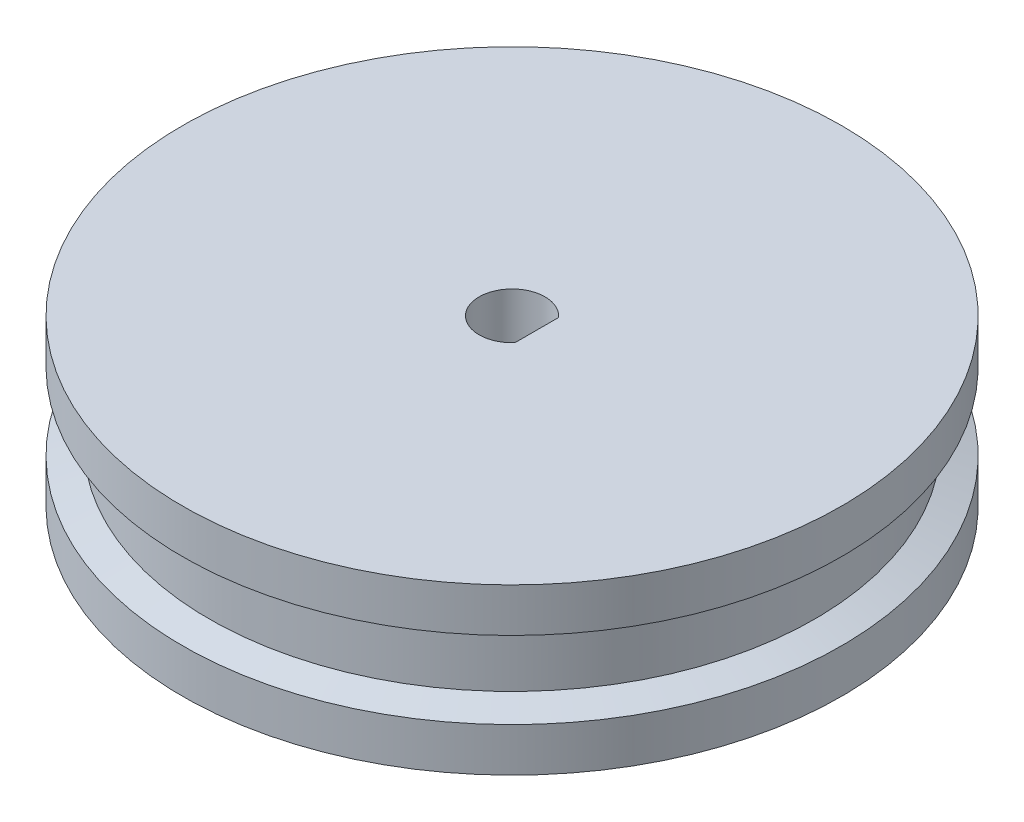
ISO-10303-21;
HEADER;
FILE_DESCRIPTION(('STEP AP214'),'2;1');
FILE_NAME('part.step','',(''),(''),'','','');
FILE_SCHEMA(('AUTOMOTIVE_DESIGN { 1 0 10303 214 1 1 1 1 }'));
ENDSEC;
DATA;
#1=APPLICATION_CONTEXT('core data for automotive mechanical design processes');
#2=APPLICATION_PROTOCOL_DEFINITION('international standard','automotive_design',2000,#1);
#3=PRODUCT_CONTEXT('',#1,'mechanical');
#4=PRODUCT('Part','Part','',(#3));
#5=PRODUCT_RELATED_PRODUCT_CATEGORY('part','',(#4));
#6=PRODUCT_DEFINITION_FORMATION('','',#4);
#7=PRODUCT_DEFINITION_CONTEXT('part definition',#1,'design');
#8=PRODUCT_DEFINITION('design','',#6,#7);
#9=PRODUCT_DEFINITION_SHAPE('','',#8);
#10=(LENGTH_UNIT() NAMED_UNIT(*) SI_UNIT(.MILLI.,.METRE.));
#11=(NAMED_UNIT(*) PLANE_ANGLE_UNIT() SI_UNIT($,.RADIAN.));
#12=(NAMED_UNIT(*) SI_UNIT($,.STERADIAN.) SOLID_ANGLE_UNIT());
#13=UNCERTAINTY_MEASURE_WITH_UNIT(LENGTH_MEASURE(1.E-05),#10,'distance_accuracy_value','');
#14=(GEOMETRIC_REPRESENTATION_CONTEXT(3) GLOBAL_UNCERTAINTY_ASSIGNED_CONTEXT((#13)) GLOBAL_UNIT_ASSIGNED_CONTEXT((#10,
#11,#12)) REPRESENTATION_CONTEXT('',''));
#15=CARTESIAN_POINT('',(0.,0.,0.));
#16=DIRECTION('',(0.,0.,1.));
#17=DIRECTION('',(1.,0.,0.));
#18=AXIS2_PLACEMENT_3D('',#15,#16,#17);
#19=CARTESIAN_POINT('',(0.,-10.,0.));
#20=DIRECTION('',(0.,-1.,0.));
#21=DIRECTION('',(0.,0.,-1.));
#22=AXIS2_PLACEMENT_3D('',#19,#20,#21);
#23=PLANE('',#22);
#24=CARTESIAN_POINT('',(0.,-10.,0.));
#25=DIRECTION('',(0.,-1.,0.));
#26=DIRECTION('',(0.,0.,-1.));
#27=AXIS2_PLACEMENT_3D('',#24,#25,#26);
#28=CIRCLE('',#27,4.);
#29=CARTESIAN_POINT('',(3.,-10.,2.64575131106459));
#30=VERTEX_POINT('',#29);
#31=CARTESIAN_POINT('',(3.,-10.,-2.64575131106459));
#32=VERTEX_POINT('',#31);
#33=EDGE_CURVE('E69',#30,#32,#28,.T.);
#34=ORIENTED_EDGE('',*,*,#33,.F.);
#35=DIRECTION('',(0.,0.,1.));
#36=VECTOR('',#35,1.);
#37=CARTESIAN_POINT('',(3.,-10.,0.));
#38=LINE('',#37,#36);
#39=EDGE_CURVE('E64',#32,#30,#38,.T.);
#40=ORIENTED_EDGE('',*,*,#39,.F.);
#41=EDGE_LOOP('',(#34,#40));
#42=FACE_BOUND('',#41,.T.);
#43=CARTESIAN_POINT('',(0.,-10.,0.));
#44=DIRECTION('',(0.,-1.,0.));
#45=DIRECTION('',(0.,0.,-1.));
#46=AXIS2_PLACEMENT_3D('',#43,#44,#45);
#47=CIRCLE('',#46,40.);
#48=CARTESIAN_POINT('',(0.,-10.,-40.));
#49=VERTEX_POINT('',#48);
#50=EDGE_CURVE('E101',#49,#49,#47,.T.);
#51=ORIENTED_EDGE('',*,*,#50,.T.);
#52=EDGE_LOOP('',(#51));
#53=FACE_BOUND('',#52,.T.);
#54=ADVANCED_FACE('F39',(#42,#53),#23,.T.);
#55=CARTESIAN_POINT('',(0.,0.,0.));
#56=DIRECTION('',(0.,-1.,0.));
#57=DIRECTION('',(0.,0.,-1.));
#58=AXIS2_PLACEMENT_3D('',#55,#56,#57);
#59=CYLINDRICAL_SURFACE('',#58,40.);
#60=CARTESIAN_POINT('',(0.,-4.68290326136516,0.));
#61=DIRECTION('',(0.,-1.,0.));
#62=DIRECTION('',(0.,0.,-1.));
#63=AXIS2_PLACEMENT_3D('',#60,#61,#62);
#64=CIRCLE('',#63,40.);
#65=CARTESIAN_POINT('',(0.,-4.68290326136516,-40.));
#66=VERTEX_POINT('',#65);
#67=EDGE_CURVE('E97',#66,#66,#64,.T.);
#68=ORIENTED_EDGE('',*,*,#67,.T.);
#69=EDGE_LOOP('',(#68));
#70=FACE_BOUND('',#69,.T.);
#71=ORIENTED_EDGE('',*,*,#50,.F.);
#72=EDGE_LOOP('',(#71));
#73=FACE_BOUND('',#72,.T.);
#74=ADVANCED_FACE('F135',(#70,#73),#59,.T.);
#75=CARTESIAN_POINT('',(0.,-4.68290326136516,0.));
#76=DIRECTION('',(0.,-1.,0.));
#77=DIRECTION('',(0.,0.,-1.));
#78=AXIS2_PLACEMENT_3D('',#75,#76,#77);
#79=CONICAL_SURFACE('',#78,40.,1.22173047639603);
#80=CARTESIAN_POINT('',(0.,-3.5,0.));
#81=DIRECTION('',(0.,-1.,0.));
#82=DIRECTION('',(0.,0.,-1.));
#83=AXIS2_PLACEMENT_3D('',#80,#81,#82);
#84=CIRCLE('',#83,36.75);
#85=CARTESIAN_POINT('',(0.,-3.5,-36.75));
#86=VERTEX_POINT('',#85);
#87=EDGE_CURVE('E93',#86,#86,#84,.T.);
#88=ORIENTED_EDGE('',*,*,#87,.T.);
#89=EDGE_LOOP('',(#88));
#90=FACE_BOUND('',#89,.T.);
#91=ORIENTED_EDGE('',*,*,#67,.F.);
#92=EDGE_LOOP('',(#91));
#93=FACE_BOUND('',#92,.T.);
#94=ADVANCED_FACE('F129',(#90,#93),#79,.T.);
#95=CARTESIAN_POINT('',(0.,0.,0.));
#96=DIRECTION('',(0.,-1.,0.));
#97=DIRECTION('',(0.,0.,-1.));
#98=AXIS2_PLACEMENT_3D('',#95,#96,#97);
#99=CYLINDRICAL_SURFACE('',#98,36.75);
#100=CARTESIAN_POINT('',(0.,3.5,0.));
#101=DIRECTION('',(0.,-1.,0.));
#102=DIRECTION('',(0.,0.,-1.));
#103=AXIS2_PLACEMENT_3D('',#100,#101,#102);
#104=CIRCLE('',#103,36.75);
#105=CARTESIAN_POINT('',(0.,3.5,-36.75));
#106=VERTEX_POINT('',#105);
#107=EDGE_CURVE('E89',#106,#106,#104,.T.);
#108=ORIENTED_EDGE('',*,*,#107,.T.);
#109=EDGE_LOOP('',(#108));
#110=FACE_BOUND('',#109,.T.);
#111=ORIENTED_EDGE('',*,*,#87,.F.);
#112=EDGE_LOOP('',(#111));
#113=FACE_BOUND('',#112,.T.);
#114=ADVANCED_FACE('F123',(#110,#113),#99,.T.);
#115=CARTESIAN_POINT('',(0.,3.5,0.));
#116=DIRECTION('',(0.,1.,0.));
#117=DIRECTION('',(0.,0.,1.));
#118=AXIS2_PLACEMENT_3D('',#115,#116,#117);
#119=CONICAL_SURFACE('',#118,36.75,1.22173047639603);
#120=CARTESIAN_POINT('',(0.,4.68290326136516,0.));
#121=DIRECTION('',(0.,-1.,0.));
#122=DIRECTION('',(0.,0.,-1.));
#123=AXIS2_PLACEMENT_3D('',#120,#121,#122);
#124=CIRCLE('',#123,40.);
#125=CARTESIAN_POINT('',(0.,4.68290326136516,-40.));
#126=VERTEX_POINT('',#125);
#127=EDGE_CURVE('E83',#126,#126,#124,.T.);
#128=ORIENTED_EDGE('',*,*,#127,.T.);
#129=EDGE_LOOP('',(#128));
#130=FACE_BOUND('',#129,.T.);
#131=ORIENTED_EDGE('',*,*,#107,.F.);
#132=EDGE_LOOP('',(#131));
#133=FACE_BOUND('',#132,.T.);
#134=ADVANCED_FACE('F117',(#130,#133),#119,.T.);
#135=CARTESIAN_POINT('',(0.,0.,0.));
#136=DIRECTION('',(0.,-1.,0.));
#137=DIRECTION('',(0.,0.,-1.));
#138=AXIS2_PLACEMENT_3D('',#135,#136,#137);
#139=CYLINDRICAL_SURFACE('',#138,40.);
#140=CARTESIAN_POINT('',(0.,10.,0.));
#141=DIRECTION('',(0.,-1.,0.));
#142=DIRECTION('',(0.,0.,-1.));
#143=AXIS2_PLACEMENT_3D('',#140,#141,#142);
#144=CIRCLE('',#143,40.);
#145=CARTESIAN_POINT('',(0.,10.,-40.));
#146=VERTEX_POINT('',#145);
#147=EDGE_CURVE('E79',#146,#146,#144,.T.);
#148=ORIENTED_EDGE('',*,*,#147,.T.);
#149=EDGE_LOOP('',(#148));
#150=FACE_BOUND('',#149,.T.);
#151=ORIENTED_EDGE('',*,*,#127,.F.);
#152=EDGE_LOOP('',(#151));
#153=FACE_BOUND('',#152,.T.);
#154=ADVANCED_FACE('F111',(#150,#153),#139,.T.);
#155=CARTESIAN_POINT('',(0.,10.,-40.));
#156=DIRECTION('',(0.,1.,0.));
#157=DIRECTION('',(0.,0.,1.));
#158=AXIS2_PLACEMENT_3D('',#155,#156,#157);
#159=PLANE('',#158);
#160=CARTESIAN_POINT('',(0.,9.99999999999999,0.));
#161=DIRECTION('',(0.,1.,0.));
#162=DIRECTION('',(0.,0.,1.));
#163=AXIS2_PLACEMENT_3D('',#160,#161,#162);
#164=CIRCLE('',#163,4.);
#165=CARTESIAN_POINT('',(3.,9.99999999999999,-2.64575131106459));
#166=VERTEX_POINT('',#165);
#167=CARTESIAN_POINT('',(3.,10.,2.64575131106459));
#168=VERTEX_POINT('',#167);
#169=EDGE_CURVE('E11',#166,#168,#164,.T.);
#170=ORIENTED_EDGE('',*,*,#169,.F.);
#171=DIRECTION('',(0.,0.,-1.));
#172=VECTOR('',#171,1.);
#173=CARTESIAN_POINT('',(3.,10.,-40.));
#174=LINE('',#173,#172);
#175=EDGE_CURVE('E47',#168,#166,#174,.T.);
#176=ORIENTED_EDGE('',*,*,#175,.F.);
#177=EDGE_LOOP('',(#170,#176));
#178=FACE_BOUND('',#177,.T.);
#179=ORIENTED_EDGE('',*,*,#147,.F.);
#180=EDGE_LOOP('',(#179));
#181=FACE_BOUND('',#180,.T.);
#182=ADVANCED_FACE('F108',(#178,#181),#159,.T.);
#183=CARTESIAN_POINT('',(0.,-15.,0.));
#184=DIRECTION('',(0.,1.,0.));
#185=DIRECTION('',(0.,0.,1.));
#186=AXIS2_PLACEMENT_3D('',#183,#184,#185);
#187=CYLINDRICAL_SURFACE('',#186,4.);
#188=ORIENTED_EDGE('',*,*,#33,.T.);
#189=DIRECTION('',(0.,1.,0.));
#190=VECTOR('',#189,1.);
#191=CARTESIAN_POINT('',(3.,-15.,-2.64575131106459));
#192=LINE('',#191,#190);
#193=EDGE_CURVE('E54',#32,#166,#192,.T.);
#194=ORIENTED_EDGE('',*,*,#193,.T.);
#195=ORIENTED_EDGE('',*,*,#169,.T.);
#196=DIRECTION('',(0.,1.,0.));
#197=VECTOR('',#196,1.);
#198=CARTESIAN_POINT('',(3.,-15.,2.64575131106459));
#199=LINE('',#198,#197);
#200=EDGE_CURVE('E59',#30,#168,#199,.T.);
#201=ORIENTED_EDGE('',*,*,#200,.F.);
#202=EDGE_LOOP('',(#188,#194,#195,#201));
#203=FACE_BOUND('',#202,.T.);
#204=ADVANCED_FACE('F72',(#203),#187,.F.);
#205=CARTESIAN_POINT('',(3.,-15.,-2.64575131106459));
#206=DIRECTION('',(1.,0.,0.));
#207=DIRECTION('',(0.,0.,-1.));
#208=AXIS2_PLACEMENT_3D('',#205,#206,#207);
#209=PLANE('',#208);
#210=ORIENTED_EDGE('',*,*,#39,.T.);
#211=ORIENTED_EDGE('',*,*,#200,.T.);
#212=ORIENTED_EDGE('',*,*,#175,.T.);
#213=ORIENTED_EDGE('',*,*,#193,.F.);
#214=EDGE_LOOP('',(#210,#211,#212,#213));
#215=FACE_BOUND('',#214,.T.);
#216=ADVANCED_FACE('F65',(#215),#209,.F.);
#217=CLOSED_SHELL('',(#54,#74,#94,#114,#134,#154,#182,#204,#216));
#218=MANIFOLD_SOLID_BREP('B2',#217);
#219=ADVANCED_BREP_SHAPE_REPRESENTATION('',(#18,#218),#14);
#220=SHAPE_DEFINITION_REPRESENTATION(#9,#219);
ENDSEC;
END-ISO-10303-21;
